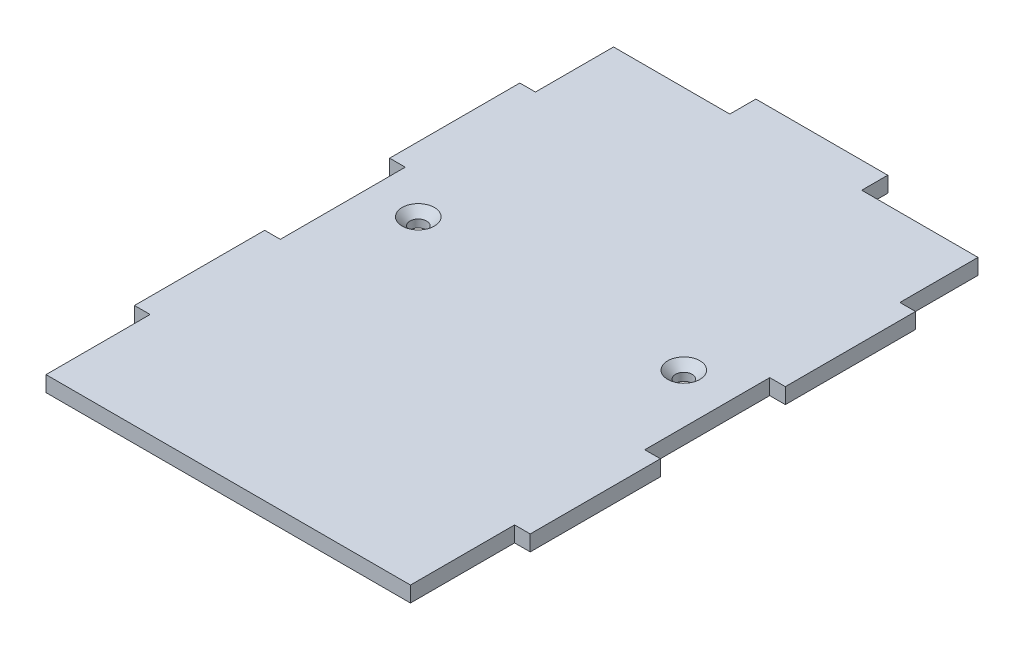
ISO-10303-21;
HEADER;
FILE_DESCRIPTION(('STEP AP214'),'2;1');
FILE_NAME('part.step','',(''),(''),'','','');
FILE_SCHEMA(('AUTOMOTIVE_DESIGN { 1 0 10303 214 1 1 1 1 }'));
ENDSEC;
DATA;
#1=APPLICATION_CONTEXT('core data for automotive mechanical design processes');
#2=APPLICATION_PROTOCOL_DEFINITION('international standard','automotive_design',2000,#1);
#3=PRODUCT_CONTEXT('',#1,'mechanical');
#4=PRODUCT('Part','Part','',(#3));
#5=PRODUCT_RELATED_PRODUCT_CATEGORY('part','',(#4));
#6=PRODUCT_DEFINITION_FORMATION('','',#4);
#7=PRODUCT_DEFINITION_CONTEXT('part definition',#1,'design');
#8=PRODUCT_DEFINITION('design','',#6,#7);
#9=PRODUCT_DEFINITION_SHAPE('','',#8);
#10=(LENGTH_UNIT() NAMED_UNIT(*) SI_UNIT(.MILLI.,.METRE.));
#11=(NAMED_UNIT(*) PLANE_ANGLE_UNIT() SI_UNIT($,.RADIAN.));
#12=(NAMED_UNIT(*) SI_UNIT($,.STERADIAN.) SOLID_ANGLE_UNIT());
#13=UNCERTAINTY_MEASURE_WITH_UNIT(LENGTH_MEASURE(1.E-05),#10,'distance_accuracy_value','');
#14=(GEOMETRIC_REPRESENTATION_CONTEXT(3) GLOBAL_UNCERTAINTY_ASSIGNED_CONTEXT((#13)) GLOBAL_UNIT_ASSIGNED_CONTEXT((#10,
#11,#12)) REPRESENTATION_CONTEXT('',''));
#15=CARTESIAN_POINT('',(0.,0.,0.));
#16=DIRECTION('',(0.,0.,1.));
#17=DIRECTION('',(1.,0.,0.));
#18=AXIS2_PLACEMENT_3D('',#15,#16,#17);
#19=CARTESIAN_POINT('',(-12.6666666666667,3.,-57.));
#20=DIRECTION('',(0.,0.,1.));
#21=DIRECTION('',(1.,0.,0.));
#22=AXIS2_PLACEMENT_3D('',#19,#20,#21);
#23=PLANE('',#22);
#24=DIRECTION('',(-1.,0.,0.));
#25=VECTOR('',#24,1.);
#26=CARTESIAN_POINT('',(-12.6666666666667,0.,-57.));
#27=LINE('',#26,#25);
#28=CARTESIAN_POINT('',(12.6666666666667,0.,-57.));
#29=VERTEX_POINT('',#28);
#30=CARTESIAN_POINT('',(-12.6666666666667,0.,-57.));
#31=VERTEX_POINT('',#30);
#32=EDGE_CURVE('E168',#29,#31,#27,.T.);
#33=ORIENTED_EDGE('',*,*,#32,.T.);
#34=DIRECTION('',(0.,-1.,0.));
#35=VECTOR('',#34,1.);
#36=CARTESIAN_POINT('',(-12.6666666666667,3.,-57.));
#37=LINE('',#36,#35);
#38=CARTESIAN_POINT('',(-12.6666666666667,3.,-57.));
#39=VERTEX_POINT('',#38);
#40=EDGE_CURVE('E217',#39,#31,#37,.T.);
#41=ORIENTED_EDGE('',*,*,#40,.F.);
#42=DIRECTION('',(-1.,0.,0.));
#43=VECTOR('',#42,1.);
#44=CARTESIAN_POINT('',(-12.6666666666667,3.,-57.));
#45=LINE('',#44,#43);
#46=CARTESIAN_POINT('',(12.6666666666667,3.,-57.));
#47=VERTEX_POINT('',#46);
#48=EDGE_CURVE('E113',#47,#39,#45,.T.);
#49=ORIENTED_EDGE('',*,*,#48,.F.);
#50=DIRECTION('',(0.,-1.,0.));
#51=VECTOR('',#50,1.);
#52=CARTESIAN_POINT('',(12.6666666666667,3.,-57.));
#53=LINE('',#52,#51);
#54=EDGE_CURVE('E285',#47,#29,#53,.T.);
#55=ORIENTED_EDGE('',*,*,#54,.T.);
#56=EDGE_LOOP('',(#33,#41,#49,#55));
#57=FACE_BOUND('',#56,.T.);
#58=ADVANCED_FACE('F39',(#57),#23,.F.);
#59=CARTESIAN_POINT('',(-12.6666666666667,3.,-52.));
#60=DIRECTION('',(1.,0.,0.));
#61=DIRECTION('',(0.,0.,-1.));
#62=AXIS2_PLACEMENT_3D('',#59,#60,#61);
#63=PLANE('',#62);
#64=DIRECTION('',(0.,0.,1.));
#65=VECTOR('',#64,1.);
#66=CARTESIAN_POINT('',(-12.6666666666667,0.,-52.));
#67=LINE('',#66,#65);
#68=CARTESIAN_POINT('',(-12.6666666666667,0.,-52.));
#69=VERTEX_POINT('',#68);
#70=EDGE_CURVE('E170',#31,#69,#67,.T.);
#71=ORIENTED_EDGE('',*,*,#70,.T.);
#72=DIRECTION('',(0.,-1.,0.));
#73=VECTOR('',#72,1.);
#74=CARTESIAN_POINT('',(-12.6666666666667,3.,-52.));
#75=LINE('',#74,#73);
#76=CARTESIAN_POINT('',(-12.6666666666667,3.,-52.));
#77=VERTEX_POINT('',#76);
#78=EDGE_CURVE('E214',#77,#69,#75,.T.);
#79=ORIENTED_EDGE('',*,*,#78,.F.);
#80=DIRECTION('',(0.,0.,1.));
#81=VECTOR('',#80,1.);
#82=CARTESIAN_POINT('',(-12.6666666666667,3.,-52.));
#83=LINE('',#82,#81);
#84=EDGE_CURVE('E352',#39,#77,#83,.T.);
#85=ORIENTED_EDGE('',*,*,#84,.F.);
#86=ORIENTED_EDGE('',*,*,#40,.T.);
#87=EDGE_LOOP('',(#71,#79,#85,#86));
#88=FACE_BOUND('',#87,.T.);
#89=ADVANCED_FACE('F444',(#88),#63,.F.);
#90=CARTESIAN_POINT('',(-35.,3.,-52.));
#91=DIRECTION('',(0.,0.,1.));
#92=DIRECTION('',(1.,0.,0.));
#93=AXIS2_PLACEMENT_3D('',#90,#91,#92);
#94=PLANE('',#93);
#95=DIRECTION('',(-1.,0.,0.));
#96=VECTOR('',#95,1.);
#97=CARTESIAN_POINT('',(-35.,0.,-52.));
#98=LINE('',#97,#96);
#99=CARTESIAN_POINT('',(-35.,0.,-52.));
#100=VERTEX_POINT('',#99);
#101=EDGE_CURVE('E173',#69,#100,#98,.T.);
#102=ORIENTED_EDGE('',*,*,#101,.T.);
#103=DIRECTION('',(0.,-1.,0.));
#104=VECTOR('',#103,1.);
#105=CARTESIAN_POINT('',(-35.,3.,-52.));
#106=LINE('',#105,#104);
#107=CARTESIAN_POINT('',(-35.,3.,-52.));
#108=VERTEX_POINT('',#107);
#109=EDGE_CURVE('E211',#108,#100,#106,.T.);
#110=ORIENTED_EDGE('',*,*,#109,.F.);
#111=DIRECTION('',(-1.,0.,0.));
#112=VECTOR('',#111,1.);
#113=CARTESIAN_POINT('',(-35.,3.,-52.));
#114=LINE('',#113,#112);
#115=EDGE_CURVE('E354',#77,#108,#114,.T.);
#116=ORIENTED_EDGE('',*,*,#115,.F.);
#117=ORIENTED_EDGE('',*,*,#78,.T.);
#118=EDGE_LOOP('',(#102,#110,#116,#117));
#119=FACE_BOUND('',#118,.T.);
#120=ADVANCED_FACE('F449',(#119),#94,.F.);
#121=CARTESIAN_POINT('',(-35.,3.,-37.));
#122=DIRECTION('',(1.,0.,0.));
#123=DIRECTION('',(0.,0.,-1.));
#124=AXIS2_PLACEMENT_3D('',#121,#122,#123);
#125=PLANE('',#124);
#126=DIRECTION('',(0.,0.,1.));
#127=VECTOR('',#126,1.);
#128=CARTESIAN_POINT('',(-35.,0.,-37.));
#129=LINE('',#128,#127);
#130=CARTESIAN_POINT('',(-35.,0.,-37.));
#131=VERTEX_POINT('',#130);
#132=EDGE_CURVE('E175',#100,#131,#129,.T.);
#133=ORIENTED_EDGE('',*,*,#132,.T.);
#134=DIRECTION('',(0.,-1.,0.));
#135=VECTOR('',#134,1.);
#136=CARTESIAN_POINT('',(-35.,3.,-37.));
#137=LINE('',#136,#135);
#138=CARTESIAN_POINT('',(-35.,3.,-37.));
#139=VERTEX_POINT('',#138);
#140=EDGE_CURVE('E208',#139,#131,#137,.T.);
#141=ORIENTED_EDGE('',*,*,#140,.F.);
#142=DIRECTION('',(0.,0.,1.));
#143=VECTOR('',#142,1.);
#144=CARTESIAN_POINT('',(-35.,3.,-37.));
#145=LINE('',#144,#143);
#146=EDGE_CURVE('E356',#108,#139,#145,.T.);
#147=ORIENTED_EDGE('',*,*,#146,.F.);
#148=ORIENTED_EDGE('',*,*,#109,.T.);
#149=EDGE_LOOP('',(#133,#141,#147,#148));
#150=FACE_BOUND('',#149,.T.);
#151=ADVANCED_FACE('F460',(#150),#125,.F.);
#152=CARTESIAN_POINT('',(-38.,3.,-37.));
#153=DIRECTION('',(0.,0.,1.));
#154=DIRECTION('',(1.,0.,0.));
#155=AXIS2_PLACEMENT_3D('',#152,#153,#154);
#156=PLANE('',#155);
#157=DIRECTION('',(-1.,0.,0.));
#158=VECTOR('',#157,1.);
#159=CARTESIAN_POINT('',(-38.,0.,-37.));
#160=LINE('',#159,#158);
#161=CARTESIAN_POINT('',(-38.,0.,-37.));
#162=VERTEX_POINT('',#161);
#163=EDGE_CURVE('E177',#131,#162,#160,.T.);
#164=ORIENTED_EDGE('',*,*,#163,.T.);
#165=DIRECTION('',(0.,-1.,0.));
#166=VECTOR('',#165,1.);
#167=CARTESIAN_POINT('',(-38.,3.,-37.));
#168=LINE('',#167,#166);
#169=CARTESIAN_POINT('',(-38.,3.,-37.));
#170=VERTEX_POINT('',#169);
#171=EDGE_CURVE('E205',#170,#162,#168,.T.);
#172=ORIENTED_EDGE('',*,*,#171,.F.);
#173=DIRECTION('',(-1.,0.,0.));
#174=VECTOR('',#173,1.);
#175=CARTESIAN_POINT('',(-38.,3.,-37.));
#176=LINE('',#175,#174);
#177=EDGE_CURVE('E358',#139,#170,#176,.T.);
#178=ORIENTED_EDGE('',*,*,#177,.F.);
#179=ORIENTED_EDGE('',*,*,#140,.T.);
#180=EDGE_LOOP('',(#164,#172,#178,#179));
#181=FACE_BOUND('',#180,.T.);
#182=ADVANCED_FACE('F464',(#181),#156,.F.);
#183=CARTESIAN_POINT('',(-38.,3.,-12.));
#184=DIRECTION('',(1.,0.,0.));
#185=DIRECTION('',(0.,0.,-1.));
#186=AXIS2_PLACEMENT_3D('',#183,#184,#185);
#187=PLANE('',#186);
#188=DIRECTION('',(0.,0.,1.));
#189=VECTOR('',#188,1.);
#190=CARTESIAN_POINT('',(-38.,0.,-12.));
#191=LINE('',#190,#189);
#192=CARTESIAN_POINT('',(-38.,0.,-12.));
#193=VERTEX_POINT('',#192);
#194=EDGE_CURVE('E179',#162,#193,#191,.T.);
#195=ORIENTED_EDGE('',*,*,#194,.T.);
#196=DIRECTION('',(0.,-1.,0.));
#197=VECTOR('',#196,1.);
#198=CARTESIAN_POINT('',(-38.,3.,-12.));
#199=LINE('',#198,#197);
#200=CARTESIAN_POINT('',(-38.,3.,-12.));
#201=VERTEX_POINT('',#200);
#202=EDGE_CURVE('E202',#201,#193,#199,.T.);
#203=ORIENTED_EDGE('',*,*,#202,.F.);
#204=DIRECTION('',(0.,0.,1.));
#205=VECTOR('',#204,1.);
#206=CARTESIAN_POINT('',(-38.,3.,-12.));
#207=LINE('',#206,#205);
#208=EDGE_CURVE('E360',#170,#201,#207,.T.);
#209=ORIENTED_EDGE('',*,*,#208,.F.);
#210=ORIENTED_EDGE('',*,*,#171,.T.);
#211=EDGE_LOOP('',(#195,#203,#209,#210));
#212=FACE_BOUND('',#211,.T.);
#213=ADVANCED_FACE('F468',(#212),#187,.F.);
#214=CARTESIAN_POINT('',(-35.,3.,-12.));
#215=DIRECTION('',(0.,0.,-1.));
#216=DIRECTION('',(-1.,0.,0.));
#217=AXIS2_PLACEMENT_3D('',#214,#215,#216);
#218=PLANE('',#217);
#219=DIRECTION('',(1.,0.,0.));
#220=VECTOR('',#219,1.);
#221=CARTESIAN_POINT('',(-35.,0.,-12.));
#222=LINE('',#221,#220);
#223=CARTESIAN_POINT('',(-35.,0.,-12.));
#224=VERTEX_POINT('',#223);
#225=EDGE_CURVE('E181',#193,#224,#222,.T.);
#226=ORIENTED_EDGE('',*,*,#225,.T.);
#227=DIRECTION('',(0.,-1.,0.));
#228=VECTOR('',#227,1.);
#229=CARTESIAN_POINT('',(-35.,3.,-12.));
#230=LINE('',#229,#228);
#231=CARTESIAN_POINT('',(-35.,3.,-12.));
#232=VERTEX_POINT('',#231);
#233=EDGE_CURVE('E199',#232,#224,#230,.T.);
#234=ORIENTED_EDGE('',*,*,#233,.F.);
#235=DIRECTION('',(1.,0.,0.));
#236=VECTOR('',#235,1.);
#237=CARTESIAN_POINT('',(-35.,3.,-12.));
#238=LINE('',#237,#236);
#239=EDGE_CURVE('E362',#201,#232,#238,.T.);
#240=ORIENTED_EDGE('',*,*,#239,.F.);
#241=ORIENTED_EDGE('',*,*,#202,.T.);
#242=EDGE_LOOP('',(#226,#234,#240,#241));
#243=FACE_BOUND('',#242,.T.);
#244=ADVANCED_FACE('F472',(#243),#218,.F.);
#245=CARTESIAN_POINT('',(-35.,3.,12.));
#246=DIRECTION('',(1.,0.,0.));
#247=DIRECTION('',(0.,0.,-1.));
#248=AXIS2_PLACEMENT_3D('',#245,#246,#247);
#249=PLANE('',#248);
#250=DIRECTION('',(0.,0.,1.));
#251=VECTOR('',#250,1.);
#252=CARTESIAN_POINT('',(-35.,0.,12.));
#253=LINE('',#252,#251);
#254=CARTESIAN_POINT('',(-35.,0.,12.));
#255=VERTEX_POINT('',#254);
#256=EDGE_CURVE('E183',#224,#255,#253,.T.);
#257=ORIENTED_EDGE('',*,*,#256,.T.);
#258=DIRECTION('',(0.,-1.,0.));
#259=VECTOR('',#258,1.);
#260=CARTESIAN_POINT('',(-35.,3.,12.));
#261=LINE('',#260,#259);
#262=CARTESIAN_POINT('',(-35.,3.,12.));
#263=VERTEX_POINT('',#262);
#264=EDGE_CURVE('E196',#263,#255,#261,.T.);
#265=ORIENTED_EDGE('',*,*,#264,.F.);
#266=DIRECTION('',(0.,0.,1.));
#267=VECTOR('',#266,1.);
#268=CARTESIAN_POINT('',(-35.,3.,12.));
#269=LINE('',#268,#267);
#270=EDGE_CURVE('E364',#232,#263,#269,.T.);
#271=ORIENTED_EDGE('',*,*,#270,.F.);
#272=ORIENTED_EDGE('',*,*,#233,.T.);
#273=EDGE_LOOP('',(#257,#265,#271,#272));
#274=FACE_BOUND('',#273,.T.);
#275=ADVANCED_FACE('F370',(#274),#249,.F.);
#276=CARTESIAN_POINT('',(-38.,3.,12.));
#277=DIRECTION('',(0.,0.,1.));
#278=DIRECTION('',(1.,0.,0.));
#279=AXIS2_PLACEMENT_3D('',#276,#277,#278);
#280=PLANE('',#279);
#281=DIRECTION('',(-1.,0.,0.));
#282=VECTOR('',#281,1.);
#283=CARTESIAN_POINT('',(-38.,0.,12.));
#284=LINE('',#283,#282);
#285=CARTESIAN_POINT('',(-38.,0.,12.));
#286=VERTEX_POINT('',#285);
#287=EDGE_CURVE('E185',#255,#286,#284,.T.);
#288=ORIENTED_EDGE('',*,*,#287,.T.);
#289=DIRECTION('',(0.,-1.,0.));
#290=VECTOR('',#289,1.);
#291=CARTESIAN_POINT('',(-38.,3.,12.));
#292=LINE('',#291,#290);
#293=CARTESIAN_POINT('',(-38.,3.,12.));
#294=VERTEX_POINT('',#293);
#295=EDGE_CURVE('E157',#294,#286,#292,.T.);
#296=ORIENTED_EDGE('',*,*,#295,.F.);
#297=DIRECTION('',(-1.,0.,0.));
#298=VECTOR('',#297,1.);
#299=CARTESIAN_POINT('',(-38.,3.,12.));
#300=LINE('',#299,#298);
#301=EDGE_CURVE('E148',#263,#294,#300,.T.);
#302=ORIENTED_EDGE('',*,*,#301,.F.);
#303=ORIENTED_EDGE('',*,*,#264,.T.);
#304=EDGE_LOOP('',(#288,#296,#302,#303));
#305=FACE_BOUND('',#304,.T.);
#306=ADVANCED_FACE('F374',(#305),#280,.F.);
#307=CARTESIAN_POINT('',(-38.,3.,37.));
#308=DIRECTION('',(1.,0.,0.));
#309=DIRECTION('',(0.,0.,-1.));
#310=AXIS2_PLACEMENT_3D('',#307,#308,#309);
#311=PLANE('',#310);
#312=DIRECTION('',(0.,0.,1.));
#313=VECTOR('',#312,1.);
#314=CARTESIAN_POINT('',(-38.,0.,37.));
#315=LINE('',#314,#313);
#316=CARTESIAN_POINT('',(-38.,0.,37.));
#317=VERTEX_POINT('',#316);
#318=EDGE_CURVE('E156',#286,#317,#315,.T.);
#319=ORIENTED_EDGE('',*,*,#318,.T.);
#320=DIRECTION('',(0.,-1.,0.));
#321=VECTOR('',#320,1.);
#322=CARTESIAN_POINT('',(-38.,3.,37.));
#323=LINE('',#322,#321);
#324=CARTESIAN_POINT('',(-38.,3.,37.));
#325=VERTEX_POINT('',#324);
#326=EDGE_CURVE('E153',#325,#317,#323,.T.);
#327=ORIENTED_EDGE('',*,*,#326,.F.);
#328=DIRECTION('',(0.,0.,1.));
#329=VECTOR('',#328,1.);
#330=CARTESIAN_POINT('',(-38.,3.,37.));
#331=LINE('',#330,#329);
#332=EDGE_CURVE('E142',#294,#325,#331,.T.);
#333=ORIENTED_EDGE('',*,*,#332,.F.);
#334=ORIENTED_EDGE('',*,*,#295,.T.);
#335=EDGE_LOOP('',(#319,#327,#333,#334));
#336=FACE_BOUND('',#335,.T.);
#337=ADVANCED_FACE('F154',(#336),#311,.F.);
#338=CARTESIAN_POINT('',(-35.,3.,37.));
#339=DIRECTION('',(0.,0.,-1.));
#340=DIRECTION('',(-1.,0.,0.));
#341=AXIS2_PLACEMENT_3D('',#338,#339,#340);
#342=PLANE('',#341);
#343=DIRECTION('',(1.,0.,0.));
#344=VECTOR('',#343,1.);
#345=CARTESIAN_POINT('',(-35.,0.,37.));
#346=LINE('',#345,#344);
#347=CARTESIAN_POINT('',(-35.,0.,37.));
#348=VERTEX_POINT('',#347);
#349=EDGE_CURVE('E99',#317,#348,#346,.T.);
#350=ORIENTED_EDGE('',*,*,#349,.T.);
#351=DIRECTION('',(0.,-1.,0.));
#352=VECTOR('',#351,1.);
#353=CARTESIAN_POINT('',(-35.,3.,37.));
#354=LINE('',#353,#352);
#355=CARTESIAN_POINT('',(-35.,3.,37.));
#356=VERTEX_POINT('',#355);
#357=EDGE_CURVE('E158',#356,#348,#354,.T.);
#358=ORIENTED_EDGE('',*,*,#357,.F.);
#359=DIRECTION('',(1.,0.,0.));
#360=VECTOR('',#359,1.);
#361=CARTESIAN_POINT('',(-35.,3.,37.));
#362=LINE('',#361,#360);
#363=EDGE_CURVE('E146',#325,#356,#362,.T.);
#364=ORIENTED_EDGE('',*,*,#363,.F.);
#365=ORIENTED_EDGE('',*,*,#326,.T.);
#366=EDGE_LOOP('',(#350,#358,#364,#365));
#367=FACE_BOUND('',#366,.T.);
#368=ADVANCED_FACE('F160',(#367),#342,.F.);
#369=CARTESIAN_POINT('',(-35.,3.,57.));
#370=DIRECTION('',(1.,0.,0.));
#371=DIRECTION('',(0.,0.,-1.));
#372=AXIS2_PLACEMENT_3D('',#369,#370,#371);
#373=PLANE('',#372);
#374=DIRECTION('',(0.,0.,1.));
#375=VECTOR('',#374,1.);
#376=CARTESIAN_POINT('',(-35.,0.,57.));
#377=LINE('',#376,#375);
#378=CARTESIAN_POINT('',(-35.,0.,57.));
#379=VERTEX_POINT('',#378);
#380=EDGE_CURVE('E105',#348,#379,#377,.T.);
#381=ORIENTED_EDGE('',*,*,#380,.T.);
#382=DIRECTION('',(0.,-1.,0.));
#383=VECTOR('',#382,1.);
#384=CARTESIAN_POINT('',(-35.,3.,57.));
#385=LINE('',#384,#383);
#386=CARTESIAN_POINT('',(-35.,3.,57.));
#387=VERTEX_POINT('',#386);
#388=EDGE_CURVE('E167',#387,#379,#385,.T.);
#389=ORIENTED_EDGE('',*,*,#388,.F.);
#390=DIRECTION('',(0.,0.,1.));
#391=VECTOR('',#390,1.);
#392=CARTESIAN_POINT('',(-35.,3.,57.));
#393=LINE('',#392,#391);
#394=EDGE_CURVE('E57',#356,#387,#393,.T.);
#395=ORIENTED_EDGE('',*,*,#394,.F.);
#396=ORIENTED_EDGE('',*,*,#357,.T.);
#397=EDGE_LOOP('',(#381,#389,#395,#396));
#398=FACE_BOUND('',#397,.T.);
#399=ADVANCED_FACE('F485',(#398),#373,.F.);
#400=CARTESIAN_POINT('',(0.,3.,57.));
#401=DIRECTION('',(0.,0.,-1.));
#402=DIRECTION('',(-1.,0.,0.));
#403=AXIS2_PLACEMENT_3D('',#400,#401,#402);
#404=PLANE('',#403);
#405=DIRECTION('',(1.,0.,0.));
#406=VECTOR('',#405,1.);
#407=CARTESIAN_POINT('',(0.,0.,57.));
#408=LINE('',#407,#406);
#409=CARTESIAN_POINT('',(35.,0.,57.));
#410=VERTEX_POINT('',#409);
#411=EDGE_CURVE('E190',#379,#410,#408,.T.);
#412=ORIENTED_EDGE('',*,*,#411,.T.);
#413=DIRECTION('',(0.,-1.,0.));
#414=VECTOR('',#413,1.);
#415=CARTESIAN_POINT('',(35.,3.,57.));
#416=LINE('',#415,#414);
#417=CARTESIAN_POINT('',(35.,3.,57.));
#418=VERTEX_POINT('',#417);
#419=EDGE_CURVE('E171',#418,#410,#416,.T.);
#420=ORIENTED_EDGE('',*,*,#419,.F.);
#421=DIRECTION('',(1.,0.,0.));
#422=VECTOR('',#421,1.);
#423=CARTESIAN_POINT('',(0.,3.,57.));
#424=LINE('',#423,#422);
#425=EDGE_CURVE('E162',#387,#418,#424,.T.);
#426=ORIENTED_EDGE('',*,*,#425,.F.);
#427=ORIENTED_EDGE('',*,*,#388,.T.);
#428=EDGE_LOOP('',(#412,#420,#426,#427));
#429=FACE_BOUND('',#428,.T.);
#430=ADVANCED_FACE('F383',(#429),#404,.F.);
#431=CARTESIAN_POINT('',(0.,3.,0.));
#432=DIRECTION('',(0.,-1.,0.));
#433=DIRECTION('',(0.,0.,-1.));
#434=AXIS2_PLACEMENT_3D('',#431,#432,#433);
#435=PLANE('',#434);
#436=CARTESIAN_POINT('',(25.5,3.,-5.));
#437=DIRECTION('',(0.,-1.,0.));
#438=DIRECTION('',(0.,0.,-1.));
#439=AXIS2_PLACEMENT_3D('',#436,#437,#438);
#440=CIRCLE('',#439,3.09999999999999);
#441=CARTESIAN_POINT('',(25.5,3.,-1.90000000000001));
#442=VERTEX_POINT('',#441);
#443=EDGE_CURVE('E49',#442,#442,#440,.T.);
#444=ORIENTED_EDGE('',*,*,#443,.T.);
#445=EDGE_LOOP('',(#444));
#446=FACE_BOUND('',#445,.T.);
#447=CARTESIAN_POINT('',(-25.5,3.,-5.));
#448=DIRECTION('',(0.,-1.,0.));
#449=DIRECTION('',(0.,0.,-1.));
#450=AXIS2_PLACEMENT_3D('',#447,#448,#449);
#451=CIRCLE('',#450,3.09999999999999);
#452=CARTESIAN_POINT('',(-25.5,3.,-1.90000000000001));
#453=VERTEX_POINT('',#452);
#454=EDGE_CURVE('E223',#453,#453,#451,.T.);
#455=ORIENTED_EDGE('',*,*,#454,.T.);
#456=EDGE_LOOP('',(#455));
#457=FACE_BOUND('',#456,.T.);
#458=ORIENTED_EDGE('',*,*,#425,.T.);
#459=DIRECTION('',(0.,0.,1.));
#460=VECTOR('',#459,1.);
#461=CARTESIAN_POINT('',(35.,3.,57.));
#462=LINE('',#461,#460);
#463=CARTESIAN_POINT('',(35.,3.,37.));
#464=VERTEX_POINT('',#463);
#465=EDGE_CURVE('E251',#464,#418,#462,.T.);
#466=ORIENTED_EDGE('',*,*,#465,.F.);
#467=DIRECTION('',(-1.,0.,0.));
#468=VECTOR('',#467,1.);
#469=CARTESIAN_POINT('',(35.,3.,37.));
#470=LINE('',#469,#468);
#471=CARTESIAN_POINT('',(38.,3.,37.));
#472=VERTEX_POINT('',#471);
#473=EDGE_CURVE('E254',#472,#464,#470,.T.);
#474=ORIENTED_EDGE('',*,*,#473,.F.);
#475=DIRECTION('',(0.,0.,1.));
#476=VECTOR('',#475,1.);
#477=CARTESIAN_POINT('',(38.,3.,37.));
#478=LINE('',#477,#476);
#479=CARTESIAN_POINT('',(38.,3.,12.));
#480=VERTEX_POINT('',#479);
#481=EDGE_CURVE('E258',#480,#472,#478,.T.);
#482=ORIENTED_EDGE('',*,*,#481,.F.);
#483=DIRECTION('',(1.,0.,0.));
#484=VECTOR('',#483,1.);
#485=CARTESIAN_POINT('',(38.,3.,12.));
#486=LINE('',#485,#484);
#487=CARTESIAN_POINT('',(35.,3.,12.));
#488=VERTEX_POINT('',#487);
#489=EDGE_CURVE('E261',#488,#480,#486,.T.);
#490=ORIENTED_EDGE('',*,*,#489,.F.);
#491=DIRECTION('',(0.,0.,1.));
#492=VECTOR('',#491,1.);
#493=CARTESIAN_POINT('',(35.,3.,12.));
#494=LINE('',#493,#492);
#495=CARTESIAN_POINT('',(35.,3.,-12.));
#496=VERTEX_POINT('',#495);
#497=EDGE_CURVE('E264',#496,#488,#494,.T.);
#498=ORIENTED_EDGE('',*,*,#497,.F.);
#499=DIRECTION('',(-1.,0.,0.));
#500=VECTOR('',#499,1.);
#501=CARTESIAN_POINT('',(35.,3.,-12.));
#502=LINE('',#501,#500);
#503=CARTESIAN_POINT('',(38.,3.,-12.));
#504=VERTEX_POINT('',#503);
#505=EDGE_CURVE('E267',#504,#496,#502,.T.);
#506=ORIENTED_EDGE('',*,*,#505,.F.);
#507=DIRECTION('',(0.,0.,1.));
#508=VECTOR('',#507,1.);
#509=CARTESIAN_POINT('',(38.,3.,-12.));
#510=LINE('',#509,#508);
#511=CARTESIAN_POINT('',(38.,3.,-37.));
#512=VERTEX_POINT('',#511);
#513=EDGE_CURVE('E270',#512,#504,#510,.T.);
#514=ORIENTED_EDGE('',*,*,#513,.F.);
#515=DIRECTION('',(1.,0.,0.));
#516=VECTOR('',#515,1.);
#517=CARTESIAN_POINT('',(38.,3.,-37.));
#518=LINE('',#517,#516);
#519=CARTESIAN_POINT('',(35.,3.,-37.));
#520=VERTEX_POINT('',#519);
#521=EDGE_CURVE('E273',#520,#512,#518,.T.);
#522=ORIENTED_EDGE('',*,*,#521,.F.);
#523=DIRECTION('',(0.,0.,1.));
#524=VECTOR('',#523,1.);
#525=CARTESIAN_POINT('',(35.,3.,-37.));
#526=LINE('',#525,#524);
#527=CARTESIAN_POINT('',(35.,3.,-52.));
#528=VERTEX_POINT('',#527);
#529=EDGE_CURVE('E276',#528,#520,#526,.T.);
#530=ORIENTED_EDGE('',*,*,#529,.F.);
#531=DIRECTION('',(1.,0.,0.));
#532=VECTOR('',#531,1.);
#533=CARTESIAN_POINT('',(35.,3.,-52.));
#534=LINE('',#533,#532);
#535=CARTESIAN_POINT('',(12.6666666666667,3.,-52.));
#536=VERTEX_POINT('',#535);
#537=EDGE_CURVE('E279',#536,#528,#534,.T.);
#538=ORIENTED_EDGE('',*,*,#537,.F.);
#539=DIRECTION('',(0.,0.,1.));
#540=VECTOR('',#539,1.);
#541=CARTESIAN_POINT('',(12.6666666666667,3.,-52.));
#542=LINE('',#541,#540);
#543=EDGE_CURVE('E282',#47,#536,#542,.T.);
#544=ORIENTED_EDGE('',*,*,#543,.F.);
#545=ORIENTED_EDGE('',*,*,#48,.T.);
#546=ORIENTED_EDGE('',*,*,#84,.T.);
#547=ORIENTED_EDGE('',*,*,#115,.T.);
#548=ORIENTED_EDGE('',*,*,#146,.T.);
#549=ORIENTED_EDGE('',*,*,#177,.T.);
#550=ORIENTED_EDGE('',*,*,#208,.T.);
#551=ORIENTED_EDGE('',*,*,#239,.T.);
#552=ORIENTED_EDGE('',*,*,#270,.T.);
#553=ORIENTED_EDGE('',*,*,#301,.T.);
#554=ORIENTED_EDGE('',*,*,#332,.T.);
#555=ORIENTED_EDGE('',*,*,#363,.T.);
#556=ORIENTED_EDGE('',*,*,#394,.T.);
#557=EDGE_LOOP('',(#458,#466,#474,#482,#490,#498,#506,#514,#522,#530,#538,#544,#545,#546,#547,
#548,#549,#550,#551,#552,#553,#554,#555,#556));
#558=FACE_BOUND('',#557,.T.);
#559=ADVANCED_FACE('F144',(#446,#457,#558),#435,.F.);
#560=CARTESIAN_POINT('',(0.,0.,0.));
#561=DIRECTION('',(0.,-1.,0.));
#562=DIRECTION('',(0.,0.,-1.));
#563=AXIS2_PLACEMENT_3D('',#560,#561,#562);
#564=PLANE('',#563);
#565=CARTESIAN_POINT('',(-25.5,0.,-5.));
#566=DIRECTION('',(0.,1.,0.));
#567=DIRECTION('',(0.,0.,1.));
#568=AXIS2_PLACEMENT_3D('',#565,#566,#567);
#569=CIRCLE('',#568,1.6);
#570=CARTESIAN_POINT('',(-25.5,0.,-3.4));
#571=VERTEX_POINT('',#570);
#572=EDGE_CURVE('E245',#571,#571,#569,.T.);
#573=ORIENTED_EDGE('',*,*,#572,.T.);
#574=EDGE_LOOP('',(#573));
#575=FACE_BOUND('',#574,.T.);
#576=CARTESIAN_POINT('',(25.5,0.,-5.));
#577=DIRECTION('',(0.,1.,0.));
#578=DIRECTION('',(0.,0.,1.));
#579=AXIS2_PLACEMENT_3D('',#576,#577,#578);
#580=CIRCLE('',#579,1.6);
#581=CARTESIAN_POINT('',(25.5,0.,-3.4));
#582=VERTEX_POINT('',#581);
#583=EDGE_CURVE('E243',#582,#582,#580,.T.);
#584=ORIENTED_EDGE('',*,*,#583,.T.);
#585=EDGE_LOOP('',(#584));
#586=FACE_BOUND('',#585,.T.);
#587=ORIENTED_EDGE('',*,*,#32,.F.);
#588=DIRECTION('',(0.,0.,1.));
#589=VECTOR('',#588,1.);
#590=CARTESIAN_POINT('',(12.6666666666667,0.,-52.));
#591=LINE('',#590,#589);
#592=CARTESIAN_POINT('',(12.6666666666667,0.,-52.));
#593=VERTEX_POINT('',#592);
#594=EDGE_CURVE('E255',#29,#593,#591,.T.);
#595=ORIENTED_EDGE('',*,*,#594,.T.);
#596=DIRECTION('',(1.,0.,0.));
#597=VECTOR('',#596,1.);
#598=CARTESIAN_POINT('',(35.,0.,-52.));
#599=LINE('',#598,#597);
#600=CARTESIAN_POINT('',(35.,0.,-52.));
#601=VERTEX_POINT('',#600);
#602=EDGE_CURVE('E312',#593,#601,#599,.T.);
#603=ORIENTED_EDGE('',*,*,#602,.T.);
#604=DIRECTION('',(0.,0.,1.));
#605=VECTOR('',#604,1.);
#606=CARTESIAN_POINT('',(35.,0.,-37.));
#607=LINE('',#606,#605);
#608=CARTESIAN_POINT('',(35.,0.,-37.));
#609=VERTEX_POINT('',#608);
#610=EDGE_CURVE('E309',#601,#609,#607,.T.);
#611=ORIENTED_EDGE('',*,*,#610,.T.);
#612=DIRECTION('',(1.,0.,0.));
#613=VECTOR('',#612,1.);
#614=CARTESIAN_POINT('',(38.,0.,-37.));
#615=LINE('',#614,#613);
#616=CARTESIAN_POINT('',(38.,0.,-37.));
#617=VERTEX_POINT('',#616);
#618=EDGE_CURVE('E306',#609,#617,#615,.T.);
#619=ORIENTED_EDGE('',*,*,#618,.T.);
#620=DIRECTION('',(0.,0.,1.));
#621=VECTOR('',#620,1.);
#622=CARTESIAN_POINT('',(38.,0.,-12.));
#623=LINE('',#622,#621);
#624=CARTESIAN_POINT('',(38.,0.,-12.));
#625=VERTEX_POINT('',#624);
#626=EDGE_CURVE('E303',#617,#625,#623,.T.);
#627=ORIENTED_EDGE('',*,*,#626,.T.);
#628=DIRECTION('',(-1.,0.,0.));
#629=VECTOR('',#628,1.);
#630=CARTESIAN_POINT('',(35.,0.,-12.));
#631=LINE('',#630,#629);
#632=CARTESIAN_POINT('',(35.,0.,-12.));
#633=VERTEX_POINT('',#632);
#634=EDGE_CURVE('E300',#625,#633,#631,.T.);
#635=ORIENTED_EDGE('',*,*,#634,.T.);
#636=DIRECTION('',(0.,0.,1.));
#637=VECTOR('',#636,1.);
#638=CARTESIAN_POINT('',(35.,0.,12.));
#639=LINE('',#638,#637);
#640=CARTESIAN_POINT('',(35.,0.,12.));
#641=VERTEX_POINT('',#640);
#642=EDGE_CURVE('E297',#633,#641,#639,.T.);
#643=ORIENTED_EDGE('',*,*,#642,.T.);
#644=DIRECTION('',(1.,0.,0.));
#645=VECTOR('',#644,1.);
#646=CARTESIAN_POINT('',(38.,0.,12.));
#647=LINE('',#646,#645);
#648=CARTESIAN_POINT('',(38.,0.,12.));
#649=VERTEX_POINT('',#648);
#650=EDGE_CURVE('E294',#641,#649,#647,.T.);
#651=ORIENTED_EDGE('',*,*,#650,.T.);
#652=DIRECTION('',(0.,0.,1.));
#653=VECTOR('',#652,1.);
#654=CARTESIAN_POINT('',(38.,0.,37.));
#655=LINE('',#654,#653);
#656=CARTESIAN_POINT('',(38.,0.,37.));
#657=VERTEX_POINT('',#656);
#658=EDGE_CURVE('E291',#649,#657,#655,.T.);
#659=ORIENTED_EDGE('',*,*,#658,.T.);
#660=DIRECTION('',(-1.,0.,0.));
#661=VECTOR('',#660,1.);
#662=CARTESIAN_POINT('',(35.,0.,37.));
#663=LINE('',#662,#661);
#664=CARTESIAN_POINT('',(35.,0.,37.));
#665=VERTEX_POINT('',#664);
#666=EDGE_CURVE('E288',#657,#665,#663,.T.);
#667=ORIENTED_EDGE('',*,*,#666,.T.);
#668=DIRECTION('',(0.,0.,1.));
#669=VECTOR('',#668,1.);
#670=CARTESIAN_POINT('',(35.,0.,57.));
#671=LINE('',#670,#669);
#672=EDGE_CURVE('E248',#665,#410,#671,.T.);
#673=ORIENTED_EDGE('',*,*,#672,.T.);
#674=ORIENTED_EDGE('',*,*,#411,.F.);
#675=ORIENTED_EDGE('',*,*,#380,.F.);
#676=ORIENTED_EDGE('',*,*,#349,.F.);
#677=ORIENTED_EDGE('',*,*,#318,.F.);
#678=ORIENTED_EDGE('',*,*,#287,.F.);
#679=ORIENTED_EDGE('',*,*,#256,.F.);
#680=ORIENTED_EDGE('',*,*,#225,.F.);
#681=ORIENTED_EDGE('',*,*,#194,.F.);
#682=ORIENTED_EDGE('',*,*,#163,.F.);
#683=ORIENTED_EDGE('',*,*,#132,.F.);
#684=ORIENTED_EDGE('',*,*,#101,.F.);
#685=ORIENTED_EDGE('',*,*,#70,.F.);
#686=EDGE_LOOP('',(#587,#595,#603,#611,#619,#627,#635,#643,#651,#659,#667,#673,#674,#675,#676,
#677,#678,#679,#680,#681,#682,#683,#684,#685));
#687=FACE_BOUND('',#686,.T.);
#688=ADVANCED_FACE('F377',(#575,#586,#687),#564,.T.);
#689=CARTESIAN_POINT('',(35.,3.,57.));
#690=DIRECTION('',(1.,0.,0.));
#691=DIRECTION('',(0.,0.,-1.));
#692=AXIS2_PLACEMENT_3D('',#689,#690,#691);
#693=PLANE('',#692);
#694=ORIENTED_EDGE('',*,*,#672,.F.);
#695=DIRECTION('',(0.,-1.,0.));
#696=VECTOR('',#695,1.);
#697=CARTESIAN_POINT('',(35.,3.,37.));
#698=LINE('',#697,#696);
#699=EDGE_CURVE('E346',#464,#665,#698,.T.);
#700=ORIENTED_EDGE('',*,*,#699,.F.);
#701=ORIENTED_EDGE('',*,*,#465,.T.);
#702=ORIENTED_EDGE('',*,*,#419,.T.);
#703=EDGE_LOOP('',(#694,#700,#701,#702));
#704=FACE_BOUND('',#703,.T.);
#705=ADVANCED_FACE('F389',(#704),#693,.T.);
#706=CARTESIAN_POINT('',(35.,3.,37.));
#707=DIRECTION('',(0.,0.,1.));
#708=DIRECTION('',(1.,0.,0.));
#709=AXIS2_PLACEMENT_3D('',#706,#707,#708);
#710=PLANE('',#709);
#711=ORIENTED_EDGE('',*,*,#666,.F.);
#712=DIRECTION('',(0.,-1.,0.));
#713=VECTOR('',#712,1.);
#714=CARTESIAN_POINT('',(38.,3.,37.));
#715=LINE('',#714,#713);
#716=EDGE_CURVE('E343',#472,#657,#715,.T.);
#717=ORIENTED_EDGE('',*,*,#716,.F.);
#718=ORIENTED_EDGE('',*,*,#473,.T.);
#719=ORIENTED_EDGE('',*,*,#699,.T.);
#720=EDGE_LOOP('',(#711,#717,#718,#719));
#721=FACE_BOUND('',#720,.T.);
#722=ADVANCED_FACE('F401',(#721),#710,.T.);
#723=CARTESIAN_POINT('',(38.,3.,37.));
#724=DIRECTION('',(1.,0.,0.));
#725=DIRECTION('',(0.,0.,-1.));
#726=AXIS2_PLACEMENT_3D('',#723,#724,#725);
#727=PLANE('',#726);
#728=ORIENTED_EDGE('',*,*,#658,.F.);
#729=DIRECTION('',(0.,-1.,0.));
#730=VECTOR('',#729,1.);
#731=CARTESIAN_POINT('',(38.,3.,12.));
#732=LINE('',#731,#730);
#733=EDGE_CURVE('E340',#480,#649,#732,.T.);
#734=ORIENTED_EDGE('',*,*,#733,.F.);
#735=ORIENTED_EDGE('',*,*,#481,.T.);
#736=ORIENTED_EDGE('',*,*,#716,.T.);
#737=EDGE_LOOP('',(#728,#734,#735,#736));
#738=FACE_BOUND('',#737,.T.);
#739=ADVANCED_FACE('F407',(#738),#727,.T.);
#740=CARTESIAN_POINT('',(38.,3.,12.));
#741=DIRECTION('',(0.,0.,-1.));
#742=DIRECTION('',(-1.,0.,0.));
#743=AXIS2_PLACEMENT_3D('',#740,#741,#742);
#744=PLANE('',#743);
#745=ORIENTED_EDGE('',*,*,#650,.F.);
#746=DIRECTION('',(0.,-1.,0.));
#747=VECTOR('',#746,1.);
#748=CARTESIAN_POINT('',(35.,3.,12.));
#749=LINE('',#748,#747);
#750=EDGE_CURVE('E337',#488,#641,#749,.T.);
#751=ORIENTED_EDGE('',*,*,#750,.F.);
#752=ORIENTED_EDGE('',*,*,#489,.T.);
#753=ORIENTED_EDGE('',*,*,#733,.T.);
#754=EDGE_LOOP('',(#745,#751,#752,#753));
#755=FACE_BOUND('',#754,.T.);
#756=ADVANCED_FACE('F501',(#755),#744,.T.);
#757=CARTESIAN_POINT('',(35.,3.,12.));
#758=DIRECTION('',(1.,0.,0.));
#759=DIRECTION('',(0.,0.,-1.));
#760=AXIS2_PLACEMENT_3D('',#757,#758,#759);
#761=PLANE('',#760);
#762=ORIENTED_EDGE('',*,*,#642,.F.);
#763=DIRECTION('',(0.,-1.,0.));
#764=VECTOR('',#763,1.);
#765=CARTESIAN_POINT('',(35.,3.,-12.));
#766=LINE('',#765,#764);
#767=EDGE_CURVE('E334',#496,#633,#766,.T.);
#768=ORIENTED_EDGE('',*,*,#767,.F.);
#769=ORIENTED_EDGE('',*,*,#497,.T.);
#770=ORIENTED_EDGE('',*,*,#750,.T.);
#771=EDGE_LOOP('',(#762,#768,#769,#770));
#772=FACE_BOUND('',#771,.T.);
#773=ADVANCED_FACE('F504',(#772),#761,.T.);
#774=CARTESIAN_POINT('',(35.,3.,-12.));
#775=DIRECTION('',(0.,0.,1.));
#776=DIRECTION('',(1.,0.,0.));
#777=AXIS2_PLACEMENT_3D('',#774,#775,#776);
#778=PLANE('',#777);
#779=ORIENTED_EDGE('',*,*,#634,.F.);
#780=DIRECTION('',(0.,-1.,0.));
#781=VECTOR('',#780,1.);
#782=CARTESIAN_POINT('',(38.,3.,-12.));
#783=LINE('',#782,#781);
#784=EDGE_CURVE('E331',#504,#625,#783,.T.);
#785=ORIENTED_EDGE('',*,*,#784,.F.);
#786=ORIENTED_EDGE('',*,*,#505,.T.);
#787=ORIENTED_EDGE('',*,*,#767,.T.);
#788=EDGE_LOOP('',(#779,#785,#786,#787));
#789=FACE_BOUND('',#788,.T.);
#790=ADVANCED_FACE('F508',(#789),#778,.T.);
#791=CARTESIAN_POINT('',(38.,3.,-12.));
#792=DIRECTION('',(1.,0.,0.));
#793=DIRECTION('',(0.,0.,-1.));
#794=AXIS2_PLACEMENT_3D('',#791,#792,#793);
#795=PLANE('',#794);
#796=ORIENTED_EDGE('',*,*,#626,.F.);
#797=DIRECTION('',(0.,-1.,0.));
#798=VECTOR('',#797,1.);
#799=CARTESIAN_POINT('',(38.,3.,-37.));
#800=LINE('',#799,#798);
#801=EDGE_CURVE('E328',#512,#617,#800,.T.);
#802=ORIENTED_EDGE('',*,*,#801,.F.);
#803=ORIENTED_EDGE('',*,*,#513,.T.);
#804=ORIENTED_EDGE('',*,*,#784,.T.);
#805=EDGE_LOOP('',(#796,#802,#803,#804));
#806=FACE_BOUND('',#805,.T.);
#807=ADVANCED_FACE('F512',(#806),#795,.T.);
#808=CARTESIAN_POINT('',(38.,3.,-37.));
#809=DIRECTION('',(0.,0.,-1.));
#810=DIRECTION('',(-1.,0.,0.));
#811=AXIS2_PLACEMENT_3D('',#808,#809,#810);
#812=PLANE('',#811);
#813=ORIENTED_EDGE('',*,*,#618,.F.);
#814=DIRECTION('',(0.,-1.,0.));
#815=VECTOR('',#814,1.);
#816=CARTESIAN_POINT('',(35.,3.,-37.));
#817=LINE('',#816,#815);
#818=EDGE_CURVE('E325',#520,#609,#817,.T.);
#819=ORIENTED_EDGE('',*,*,#818,.F.);
#820=ORIENTED_EDGE('',*,*,#521,.T.);
#821=ORIENTED_EDGE('',*,*,#801,.T.);
#822=EDGE_LOOP('',(#813,#819,#820,#821));
#823=FACE_BOUND('',#822,.T.);
#824=ADVANCED_FACE('F516',(#823),#812,.T.);
#825=CARTESIAN_POINT('',(35.,3.,-37.));
#826=DIRECTION('',(1.,0.,0.));
#827=DIRECTION('',(0.,0.,-1.));
#828=AXIS2_PLACEMENT_3D('',#825,#826,#827);
#829=PLANE('',#828);
#830=ORIENTED_EDGE('',*,*,#610,.F.);
#831=DIRECTION('',(0.,-1.,0.));
#832=VECTOR('',#831,1.);
#833=CARTESIAN_POINT('',(35.,3.,-52.));
#834=LINE('',#833,#832);
#835=EDGE_CURVE('E322',#528,#601,#834,.T.);
#836=ORIENTED_EDGE('',*,*,#835,.F.);
#837=ORIENTED_EDGE('',*,*,#529,.T.);
#838=ORIENTED_EDGE('',*,*,#818,.T.);
#839=EDGE_LOOP('',(#830,#836,#837,#838));
#840=FACE_BOUND('',#839,.T.);
#841=ADVANCED_FACE('F440',(#840),#829,.T.);
#842=CARTESIAN_POINT('',(35.,3.,-52.));
#843=DIRECTION('',(0.,0.,-1.));
#844=DIRECTION('',(-1.,0.,0.));
#845=AXIS2_PLACEMENT_3D('',#842,#843,#844);
#846=PLANE('',#845);
#847=ORIENTED_EDGE('',*,*,#602,.F.);
#848=DIRECTION('',(0.,-1.,0.));
#849=VECTOR('',#848,1.);
#850=CARTESIAN_POINT('',(12.6666666666667,3.,-52.));
#851=LINE('',#850,#849);
#852=EDGE_CURVE('E319',#536,#593,#851,.T.);
#853=ORIENTED_EDGE('',*,*,#852,.F.);
#854=ORIENTED_EDGE('',*,*,#537,.T.);
#855=ORIENTED_EDGE('',*,*,#835,.T.);
#856=EDGE_LOOP('',(#847,#853,#854,#855));
#857=FACE_BOUND('',#856,.T.);
#858=ADVANCED_FACE('F435',(#857),#846,.T.);
#859=CARTESIAN_POINT('',(12.6666666666667,3.,-52.));
#860=DIRECTION('',(1.,0.,0.));
#861=DIRECTION('',(0.,0.,-1.));
#862=AXIS2_PLACEMENT_3D('',#859,#860,#861);
#863=PLANE('',#862);
#864=ORIENTED_EDGE('',*,*,#594,.F.);
#865=ORIENTED_EDGE('',*,*,#54,.F.);
#866=ORIENTED_EDGE('',*,*,#543,.T.);
#867=ORIENTED_EDGE('',*,*,#852,.T.);
#868=EDGE_LOOP('',(#864,#865,#866,#867));
#869=FACE_BOUND('',#868,.T.);
#870=ADVANCED_FACE('F239',(#869),#863,.T.);
#871=CARTESIAN_POINT('',(25.5,0.,-5.));
#872=DIRECTION('',(0.,1.,0.));
#873=DIRECTION('',(0.,0.,1.));
#874=AXIS2_PLACEMENT_3D('',#871,#872,#873);
#875=CYLINDRICAL_SURFACE('',#874,1.6);
#876=CARTESIAN_POINT('',(25.5,1.50000000000001,-5.));
#877=DIRECTION('',(0.,-1.,0.));
#878=DIRECTION('',(0.,0.,-1.));
#879=AXIS2_PLACEMENT_3D('',#876,#877,#878);
#880=CIRCLE('',#879,1.6);
#881=CARTESIAN_POINT('',(25.5,1.50000000000001,-3.4));
#882=VERTEX_POINT('',#881);
#883=EDGE_CURVE('E220',#882,#882,#880,.F.);
#884=ORIENTED_EDGE('',*,*,#883,.T.);
#885=EDGE_LOOP('',(#884));
#886=FACE_BOUND('',#885,.T.);
#887=ORIENTED_EDGE('',*,*,#583,.F.);
#888=EDGE_LOOP('',(#887));
#889=FACE_BOUND('',#888,.T.);
#890=ADVANCED_FACE('F236',(#886,#889),#875,.F.);
#891=CARTESIAN_POINT('',(-25.5,0.,-5.));
#892=DIRECTION('',(0.,1.,0.));
#893=DIRECTION('',(0.,0.,1.));
#894=AXIS2_PLACEMENT_3D('',#891,#892,#893);
#895=CYLINDRICAL_SURFACE('',#894,1.6);
#896=CARTESIAN_POINT('',(-25.5,1.50000000000001,-5.));
#897=DIRECTION('',(0.,-1.,0.));
#898=DIRECTION('',(0.,0.,-1.));
#899=AXIS2_PLACEMENT_3D('',#896,#897,#898);
#900=CIRCLE('',#899,1.6);
#901=CARTESIAN_POINT('',(-25.5,1.50000000000001,-3.4));
#902=VERTEX_POINT('',#901);
#903=EDGE_CURVE('E11',#902,#902,#900,.F.);
#904=ORIENTED_EDGE('',*,*,#903,.T.);
#905=EDGE_LOOP('',(#904));
#906=FACE_BOUND('',#905,.T.);
#907=ORIENTED_EDGE('',*,*,#572,.F.);
#908=EDGE_LOOP('',(#907));
#909=FACE_BOUND('',#908,.T.);
#910=ADVANCED_FACE('F233',(#906,#909),#895,.F.);
#911=CARTESIAN_POINT('',(25.5,1.50000000000001,-5.));
#912=DIRECTION('',(0.,1.,0.));
#913=DIRECTION('',(0.,0.,1.));
#914=AXIS2_PLACEMENT_3D('',#911,#912,#913);
#915=CONICAL_SURFACE('',#914,1.6,0.785398163397448);
#916=CARTESIAN_POINT('',(25.5,3.,-1.90000000000001));
#917=CARTESIAN_POINT('',(25.5,2.984375,-1.91562500000001));
#918=CARTESIAN_POINT('',(25.5,2.96875,-1.93125000000001));
#919=CARTESIAN_POINT('',(25.5,2.9375,-1.96250000000001));
#920=CARTESIAN_POINT('',(25.5,2.921875,-1.97812500000001));
#921=CARTESIAN_POINT('',(25.5,2.890625,-2.00937500000001));
#922=CARTESIAN_POINT('',(25.5,2.875,-2.02500000000001));
#923=CARTESIAN_POINT('',(25.5,2.84375,-2.05625000000001));
#924=CARTESIAN_POINT('',(25.5,2.828125,-2.07187500000001));
#925=CARTESIAN_POINT('',(25.5,2.796875,-2.10312500000001));
#926=CARTESIAN_POINT('',(25.5,2.78125,-2.11875000000001));
#927=CARTESIAN_POINT('',(25.5,2.75,-2.15000000000001));
#928=CARTESIAN_POINT('',(25.5,2.734375,-2.16562500000001));
#929=CARTESIAN_POINT('',(25.5,2.703125,-2.19687500000001));
#930=CARTESIAN_POINT('',(25.5,2.6875,-2.21250000000001));
#931=CARTESIAN_POINT('',(25.5,2.65625,-2.24375000000001));
#932=CARTESIAN_POINT('',(25.5,2.640625,-2.25937500000001));
#933=CARTESIAN_POINT('',(25.5,2.609375,-2.29062500000001));
#934=CARTESIAN_POINT('',(25.5,2.59375,-2.30625000000001));
#935=CARTESIAN_POINT('',(25.5,2.5625,-2.33750000000001));
#936=CARTESIAN_POINT('',(25.5,2.546875,-2.35312500000001));
#937=CARTESIAN_POINT('',(25.5,2.515625,-2.38437500000001));
#938=CARTESIAN_POINT('',(25.5,2.5,-2.40000000000001));
#939=CARTESIAN_POINT('',(25.5,2.46875,-2.43125000000001));
#940=CARTESIAN_POINT('',(25.5,2.453125,-2.44687500000001));
#941=CARTESIAN_POINT('',(25.5,2.421875,-2.47812500000001));
#942=CARTESIAN_POINT('',(25.5,2.40625,-2.49375000000001));
#943=CARTESIAN_POINT('',(25.5,2.375,-2.52500000000001));
#944=CARTESIAN_POINT('',(25.5,2.359375,-2.54062500000001));
#945=CARTESIAN_POINT('',(25.5,2.328125,-2.57187500000001));
#946=CARTESIAN_POINT('',(25.5,2.3125,-2.58750000000001));
#947=CARTESIAN_POINT('',(25.5,2.28125,-2.61875000000001));
#948=CARTESIAN_POINT('',(25.5,2.26562500000001,-2.63437500000001));
#949=CARTESIAN_POINT('',(25.5,2.23437500000001,-2.66562500000001));
#950=CARTESIAN_POINT('',(25.5,2.21875000000001,-2.68125000000001));
#951=CARTESIAN_POINT('',(25.5,2.18750000000001,-2.71250000000001));
#952=CARTESIAN_POINT('',(25.5,2.17187500000001,-2.72812500000001));
#953=CARTESIAN_POINT('',(25.5,2.14062500000001,-2.75937500000001));
#954=CARTESIAN_POINT('',(25.5,2.12500000000001,-2.77500000000001));
#955=CARTESIAN_POINT('',(25.5,2.09375000000001,-2.80625000000001));
#956=CARTESIAN_POINT('',(25.5,2.07812500000001,-2.82187500000001));
#957=CARTESIAN_POINT('',(25.5,2.04687500000001,-2.85312500000001));
#958=CARTESIAN_POINT('',(25.5,2.03125000000001,-2.86875000000001));
#959=CARTESIAN_POINT('',(25.5,2.00000000000001,-2.90000000000001));
#960=CARTESIAN_POINT('',(25.5,1.98437500000001,-2.91562500000001));
#961=CARTESIAN_POINT('',(25.5,1.95312500000001,-2.94687500000001));
#962=CARTESIAN_POINT('',(25.5,1.93750000000001,-2.96250000000001));
#963=CARTESIAN_POINT('',(25.5,1.90625000000001,-2.99375000000001));
#964=CARTESIAN_POINT('',(25.5,1.89062500000001,-3.009375));
#965=CARTESIAN_POINT('',(25.5,1.85937500000001,-3.040625));
#966=CARTESIAN_POINT('',(25.5,1.84375000000001,-3.05625));
#967=CARTESIAN_POINT('',(25.5,1.81250000000001,-3.0875));
#968=CARTESIAN_POINT('',(25.5,1.79687500000001,-3.103125));
#969=CARTESIAN_POINT('',(25.5,1.76562500000001,-3.134375));
#970=CARTESIAN_POINT('',(25.5,1.75000000000001,-3.15));
#971=CARTESIAN_POINT('',(25.5,1.71875000000001,-3.18125));
#972=CARTESIAN_POINT('',(25.5,1.70312500000001,-3.196875));
#973=CARTESIAN_POINT('',(25.5,1.67187500000001,-3.228125));
#974=CARTESIAN_POINT('',(25.5,1.65625000000001,-3.24375));
#975=CARTESIAN_POINT('',(25.5,1.62500000000001,-3.275));
#976=CARTESIAN_POINT('',(25.5,1.60937500000001,-3.290625));
#977=CARTESIAN_POINT('',(25.5,1.57812500000001,-3.321875));
#978=CARTESIAN_POINT('',(25.5,1.56250000000001,-3.3375));
#979=CARTESIAN_POINT('',(25.5,1.53125000000001,-3.36875));
#980=CARTESIAN_POINT('',(25.5,1.51562500000001,-3.384375));
#981=CARTESIAN_POINT('',(25.5,1.50000000000001,-3.4));
#982=B_SPLINE_CURVE_WITH_KNOTS('',3,(#916,#917,#918,#919,#920,#921,#922,#923,#924,#925,#926,
#927,#928,#929,#930,#931,#932,#933,#934,#935,#936,#937,#938,#939,#940,#941,#942,#943,#944,#945,
#946,#947,#948,#949,#950,#951,#952,#953,#954,#955,#956,#957,#958,#959,#960,#961,#962,#963,#964,
#965,#966,#967,#968,#969,#970,#971,#972,#973,#974,#975,#976,#977,#978,#979,#980,#981),
.UNSPECIFIED.,.F.,.F.,(4,2,2,2,2,2,2,2,2,2,2,2,2,2,2,2,2,2,2,2,2,2,2,2,2,2,2,2,2,2,2,2,4),(0.,
0.0662912607362383,0.132582521472477,0.198873782208715,0.265165042944954,0.331456303681192,
0.397747564417431,0.464038825153669,0.530330085889907,0.596621346626146,0.662912607362384,
0.729203868098623,0.795495128834861,0.861786389571099,0.928077650307338,0.994368911043576,
1.06066017177981,1.12695143251605,1.19324269325229,1.25953395398853,1.32582521472477,
1.39211647546101,1.45840773619724,1.52469899693348,1.59099025766972,1.65728151840596,
1.7235727791422,1.78986403987844,1.85615530061467,1.92244656135091,1.98873782208715,
2.05502908282339,2.12132034355963),.UNSPECIFIED.);
#983=EDGE_CURVE('BSEAM230',#442,#882,#982,.T.);
#984=ORIENTED_EDGE('',*,*,#443,.F.);
#985=ORIENTED_EDGE('',*,*,#883,.F.);
#986=ORIENTED_EDGE('',*,*,#983,.T.);
#987=ORIENTED_EDGE('',*,*,#983,.F.);
#988=EDGE_LOOP('',(#984,#986,#985,#987));
#989=FACE_BOUND('',#988,.T.);
#990=ADVANCED_FACE('F230',(#989),#915,.F.);
#991=CARTESIAN_POINT('',(-25.5,1.50000000000001,-5.));
#992=DIRECTION('',(0.,1.,0.));
#993=DIRECTION('',(0.,0.,1.));
#994=AXIS2_PLACEMENT_3D('',#991,#992,#993);
#995=CONICAL_SURFACE('',#994,1.6,0.785398163397448);
#996=CARTESIAN_POINT('',(-25.5,3.,-1.90000000000001));
#997=CARTESIAN_POINT('',(-25.5,2.984375,-1.91562500000001));
#998=CARTESIAN_POINT('',(-25.5,2.96875,-1.93125000000001));
#999=CARTESIAN_POINT('',(-25.5,2.9375,-1.96250000000001));
#1000=CARTESIAN_POINT('',(-25.5,2.921875,-1.97812500000001));
#1001=CARTESIAN_POINT('',(-25.5,2.890625,-2.00937500000001));
#1002=CARTESIAN_POINT('',(-25.5,2.875,-2.02500000000001));
#1003=CARTESIAN_POINT('',(-25.5,2.84375,-2.05625000000001));
#1004=CARTESIAN_POINT('',(-25.5,2.828125,-2.07187500000001));
#1005=CARTESIAN_POINT('',(-25.5,2.796875,-2.10312500000001));
#1006=CARTESIAN_POINT('',(-25.5,2.78125,-2.11875000000001));
#1007=CARTESIAN_POINT('',(-25.5,2.75,-2.15000000000001));
#1008=CARTESIAN_POINT('',(-25.5,2.734375,-2.16562500000001));
#1009=CARTESIAN_POINT('',(-25.5,2.703125,-2.19687500000001));
#1010=CARTESIAN_POINT('',(-25.5,2.6875,-2.21250000000001));
#1011=CARTESIAN_POINT('',(-25.5,2.65625,-2.24375000000001));
#1012=CARTESIAN_POINT('',(-25.5,2.640625,-2.25937500000001));
#1013=CARTESIAN_POINT('',(-25.5,2.609375,-2.29062500000001));
#1014=CARTESIAN_POINT('',(-25.5,2.59375,-2.30625000000001));
#1015=CARTESIAN_POINT('',(-25.5,2.5625,-2.33750000000001));
#1016=CARTESIAN_POINT('',(-25.5,2.546875,-2.35312500000001));
#1017=CARTESIAN_POINT('',(-25.5,2.515625,-2.38437500000001));
#1018=CARTESIAN_POINT('',(-25.5,2.5,-2.40000000000001));
#1019=CARTESIAN_POINT('',(-25.5,2.46875,-2.43125000000001));
#1020=CARTESIAN_POINT('',(-25.5,2.453125,-2.44687500000001));
#1021=CARTESIAN_POINT('',(-25.5,2.421875,-2.47812500000001));
#1022=CARTESIAN_POINT('',(-25.5,2.40625,-2.49375000000001));
#1023=CARTESIAN_POINT('',(-25.5,2.375,-2.52500000000001));
#1024=CARTESIAN_POINT('',(-25.5,2.359375,-2.54062500000001));
#1025=CARTESIAN_POINT('',(-25.5,2.328125,-2.57187500000001));
#1026=CARTESIAN_POINT('',(-25.5,2.3125,-2.58750000000001));
#1027=CARTESIAN_POINT('',(-25.5,2.28125,-2.61875000000001));
#1028=CARTESIAN_POINT('',(-25.5,2.26562500000001,-2.63437500000001));
#1029=CARTESIAN_POINT('',(-25.5,2.23437500000001,-2.66562500000001));
#1030=CARTESIAN_POINT('',(-25.5,2.21875000000001,-2.68125000000001));
#1031=CARTESIAN_POINT('',(-25.5,2.18750000000001,-2.71250000000001));
#1032=CARTESIAN_POINT('',(-25.5,2.17187500000001,-2.72812500000001));
#1033=CARTESIAN_POINT('',(-25.5,2.14062500000001,-2.75937500000001));
#1034=CARTESIAN_POINT('',(-25.5,2.12500000000001,-2.77500000000001));
#1035=CARTESIAN_POINT('',(-25.5,2.09375000000001,-2.80625000000001));
#1036=CARTESIAN_POINT('',(-25.5,2.07812500000001,-2.82187500000001));
#1037=CARTESIAN_POINT('',(-25.5,2.04687500000001,-2.85312500000001));
#1038=CARTESIAN_POINT('',(-25.5,2.03125000000001,-2.86875000000001));
#1039=CARTESIAN_POINT('',(-25.5,2.00000000000001,-2.90000000000001));
#1040=CARTESIAN_POINT('',(-25.5,1.98437500000001,-2.91562500000001));
#1041=CARTESIAN_POINT('',(-25.5,1.95312500000001,-2.94687500000001));
#1042=CARTESIAN_POINT('',(-25.5,1.93750000000001,-2.96250000000001));
#1043=CARTESIAN_POINT('',(-25.5,1.90625000000001,-2.99375000000001));
#1044=CARTESIAN_POINT('',(-25.5,1.89062500000001,-3.009375));
#1045=CARTESIAN_POINT('',(-25.5,1.85937500000001,-3.040625));
#1046=CARTESIAN_POINT('',(-25.5,1.84375000000001,-3.05625));
#1047=CARTESIAN_POINT('',(-25.5,1.81250000000001,-3.0875));
#1048=CARTESIAN_POINT('',(-25.5,1.79687500000001,-3.103125));
#1049=CARTESIAN_POINT('',(-25.5,1.76562500000001,-3.134375));
#1050=CARTESIAN_POINT('',(-25.5,1.75000000000001,-3.15));
#1051=CARTESIAN_POINT('',(-25.5,1.71875000000001,-3.18125));
#1052=CARTESIAN_POINT('',(-25.5,1.70312500000001,-3.196875));
#1053=CARTESIAN_POINT('',(-25.5,1.67187500000001,-3.228125));
#1054=CARTESIAN_POINT('',(-25.5,1.65625000000001,-3.24375));
#1055=CARTESIAN_POINT('',(-25.5,1.62500000000001,-3.275));
#1056=CARTESIAN_POINT('',(-25.5,1.60937500000001,-3.290625));
#1057=CARTESIAN_POINT('',(-25.5,1.57812500000001,-3.321875));
#1058=CARTESIAN_POINT('',(-25.5,1.56250000000001,-3.3375));
#1059=CARTESIAN_POINT('',(-25.5,1.53125000000001,-3.36875));
#1060=CARTESIAN_POINT('',(-25.5,1.51562500000001,-3.384375));
#1061=CARTESIAN_POINT('',(-25.5,1.50000000000001,-3.4));
#1062=B_SPLINE_CURVE_WITH_KNOTS('',3,(#996,#997,#998,#999,#1000,#1001,#1002,#1003,#1004,#1005,
#1006,#1007,#1008,#1009,#1010,#1011,#1012,#1013,#1014,#1015,#1016,#1017,#1018,#1019,#1020,#1021,
#1022,#1023,#1024,#1025,#1026,#1027,#1028,#1029,#1030,#1031,#1032,#1033,#1034,#1035,#1036,#1037,
#1038,#1039,#1040,#1041,#1042,#1043,#1044,#1045,#1046,#1047,#1048,#1049,#1050,#1051,#1052,#1053,
#1054,#1055,#1056,#1057,#1058,#1059,#1060,#1061),.UNSPECIFIED.,.F.,.F.,(4,2,2,2,2,2,2,2,2,2,2,2,
2,2,2,2,2,2,2,2,2,2,2,2,2,2,2,2,2,2,2,2,4),(0.,0.0662912607362383,0.132582521472477,
0.198873782208715,0.265165042944954,0.331456303681192,0.397747564417431,0.464038825153669,
0.530330085889907,0.596621346626146,0.662912607362384,0.729203868098623,0.795495128834861,
0.861786389571099,0.928077650307338,0.994368911043576,1.06066017177981,1.12695143251605,
1.19324269325229,1.25953395398853,1.32582521472477,1.39211647546101,1.45840773619724,
1.52469899693348,1.59099025766972,1.65728151840596,1.7235727791422,1.78986403987844,
1.85615530061467,1.92244656135091,1.98873782208715,2.05502908282339,2.12132034355963),.UNSPECIFIED.);
#1063=EDGE_CURVE('BSEAM42',#453,#902,#1062,.T.);
#1064=ORIENTED_EDGE('',*,*,#454,.F.);
#1065=ORIENTED_EDGE('',*,*,#903,.F.);
#1066=ORIENTED_EDGE('',*,*,#1063,.T.);
#1067=ORIENTED_EDGE('',*,*,#1063,.F.);
#1068=EDGE_LOOP('',(#1064,#1066,#1065,#1067));
#1069=FACE_BOUND('',#1068,.T.);
#1070=ADVANCED_FACE('F42',(#1069),#995,.F.);
#1071=CLOSED_SHELL('',(#58,#89,#120,#151,#182,#213,#244,#275,#306,#337,#368,#399,#430,#559,#688,
#705,#722,#739,#756,#773,#790,#807,#824,#841,#858,#870,#890,#910,#990,#1070));
#1072=MANIFOLD_SOLID_BREP('B2',#1071);
#1073=ADVANCED_BREP_SHAPE_REPRESENTATION('',(#18,#1072),#14);
#1074=SHAPE_DEFINITION_REPRESENTATION(#9,#1073);
ENDSEC;
END-ISO-10303-21;
